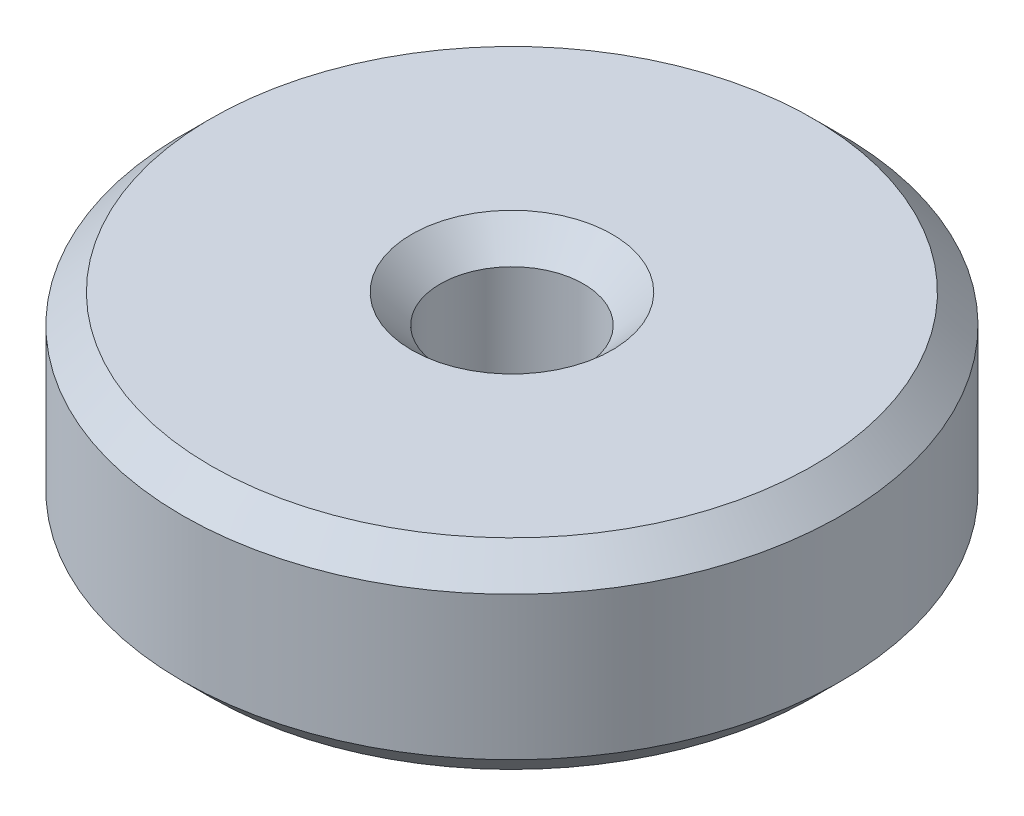
ISO-10303-21;
HEADER;
FILE_DESCRIPTION(('STEP AP214'),'2;1');
FILE_NAME('part.step','',(''),(''),'','','');
FILE_SCHEMA(('AUTOMOTIVE_DESIGN { 1 0 10303 214 1 1 1 1 }'));
ENDSEC;
DATA;
#1=APPLICATION_CONTEXT('core data for automotive mechanical design processes');
#2=APPLICATION_PROTOCOL_DEFINITION('international standard','automotive_design',2000,#1);
#3=PRODUCT_CONTEXT('',#1,'mechanical');
#4=PRODUCT('Part','Part','',(#3));
#5=PRODUCT_RELATED_PRODUCT_CATEGORY('part','',(#4));
#6=PRODUCT_DEFINITION_FORMATION('','',#4);
#7=PRODUCT_DEFINITION_CONTEXT('part definition',#1,'design');
#8=PRODUCT_DEFINITION('design','',#6,#7);
#9=PRODUCT_DEFINITION_SHAPE('','',#8);
#10=(LENGTH_UNIT() NAMED_UNIT(*) SI_UNIT(.MILLI.,.METRE.));
#11=(NAMED_UNIT(*) PLANE_ANGLE_UNIT() SI_UNIT($,.RADIAN.));
#12=(NAMED_UNIT(*) SI_UNIT($,.STERADIAN.) SOLID_ANGLE_UNIT());
#13=UNCERTAINTY_MEASURE_WITH_UNIT(LENGTH_MEASURE(1.E-05),#10,'distance_accuracy_value','');
#14=(GEOMETRIC_REPRESENTATION_CONTEXT(3) GLOBAL_UNCERTAINTY_ASSIGNED_CONTEXT((#13)) GLOBAL_UNIT_ASSIGNED_CONTEXT((#10,
#11,#12)) REPRESENTATION_CONTEXT('',''));
#15=CARTESIAN_POINT('',(0.,0.,0.));
#16=DIRECTION('',(0.,0.,1.));
#17=DIRECTION('',(1.,0.,0.));
#18=AXIS2_PLACEMENT_3D('',#15,#16,#17);
#19=CARTESIAN_POINT('',(0.,7.,0.));
#20=DIRECTION('',(0.,1.,0.));
#21=DIRECTION('',(0.,0.,1.));
#22=AXIS2_PLACEMENT_3D('',#19,#20,#21);
#23=PLANE('',#22);
#24=CARTESIAN_POINT('',(0.,7.,0.));
#25=DIRECTION('',(0.,1.,0.));
#26=DIRECTION('',(0.,0.,1.));
#27=AXIS2_PLACEMENT_3D('',#24,#25,#26);
#28=CIRCLE('',#27,3.5);
#29=CARTESIAN_POINT('',(0.,7.,3.5));
#30=VERTEX_POINT('',#29);
#31=EDGE_CURVE('E42',#30,#30,#28,.F.);
#32=ORIENTED_EDGE('',*,*,#31,.T.);
#33=EDGE_LOOP('',(#32));
#34=FACE_BOUND('',#33,.T.);
#35=CARTESIAN_POINT('',(0.,7.,0.));
#36=DIRECTION('',(0.,1.,0.));
#37=DIRECTION('',(0.,0.,1.));
#38=AXIS2_PLACEMENT_3D('',#35,#36,#37);
#39=CIRCLE('',#38,10.5);
#40=CARTESIAN_POINT('',(0.,7.,10.5));
#41=VERTEX_POINT('',#40);
#42=EDGE_CURVE('E46',#41,#41,#39,.T.);
#43=ORIENTED_EDGE('',*,*,#42,.T.);
#44=EDGE_LOOP('',(#43));
#45=FACE_BOUND('',#44,.T.);
#46=ADVANCED_FACE('F31',(#34,#45),#23,.T.);
#47=CARTESIAN_POINT('',(0.,0.,0.));
#48=DIRECTION('',(0.,1.,0.));
#49=DIRECTION('',(0.,0.,1.));
#50=AXIS2_PLACEMENT_3D('',#47,#48,#49);
#51=PLANE('',#50);
#52=CARTESIAN_POINT('',(0.,0.,0.));
#53=DIRECTION('',(0.,1.,0.));
#54=DIRECTION('',(0.,0.,1.));
#55=AXIS2_PLACEMENT_3D('',#52,#53,#54);
#56=CIRCLE('',#55,3.5);
#57=CARTESIAN_POINT('',(0.,0.,3.5));
#58=VERTEX_POINT('',#57);
#59=EDGE_CURVE('E57',#58,#58,#56,.T.);
#60=ORIENTED_EDGE('',*,*,#59,.T.);
#61=EDGE_LOOP('',(#60));
#62=FACE_BOUND('',#61,.T.);
#63=CARTESIAN_POINT('',(0.,0.,0.));
#64=DIRECTION('',(0.,1.,0.));
#65=DIRECTION('',(0.,0.,1.));
#66=AXIS2_PLACEMENT_3D('',#63,#64,#65);
#67=CIRCLE('',#66,10.5);
#68=CARTESIAN_POINT('',(0.,0.,10.5));
#69=VERTEX_POINT('',#68);
#70=EDGE_CURVE('E60',#69,#69,#67,.F.);
#71=ORIENTED_EDGE('',*,*,#70,.T.);
#72=EDGE_LOOP('',(#71));
#73=FACE_BOUND('',#72,.T.);
#74=ADVANCED_FACE('F64',(#62,#73),#51,.F.);
#75=CARTESIAN_POINT('',(0.,7.,0.));
#76=DIRECTION('',(0.,-1.,0.));
#77=DIRECTION('',(0.,0.,-1.));
#78=AXIS2_PLACEMENT_3D('',#75,#76,#77);
#79=CYLINDRICAL_SURFACE('',#78,11.5);
#80=CARTESIAN_POINT('',(0.,1.,0.));
#81=DIRECTION('',(0.,1.,0.));
#82=DIRECTION('',(0.,0.,1.));
#83=AXIS2_PLACEMENT_3D('',#80,#81,#82);
#84=CIRCLE('',#83,11.5);
#85=CARTESIAN_POINT('',(0.,1.,11.5));
#86=VERTEX_POINT('',#85);
#87=EDGE_CURVE('E10',#86,#86,#84,.T.);
#88=ORIENTED_EDGE('',*,*,#87,.T.);
#89=EDGE_LOOP('',(#88));
#90=FACE_BOUND('',#89,.T.);
#91=CARTESIAN_POINT('',(0.,6.00000000000001,0.));
#92=DIRECTION('',(0.,1.,0.));
#93=DIRECTION('',(0.,0.,1.));
#94=AXIS2_PLACEMENT_3D('',#91,#92,#93);
#95=CIRCLE('',#94,11.5);
#96=CARTESIAN_POINT('',(0.,6.00000000000001,11.5));
#97=VERTEX_POINT('',#96);
#98=EDGE_CURVE('E38',#97,#97,#95,.F.);
#99=ORIENTED_EDGE('',*,*,#98,.T.);
#100=EDGE_LOOP('',(#99));
#101=FACE_BOUND('',#100,.T.);
#102=ADVANCED_FACE('F84',(#90,#101),#79,.T.);
#103=CARTESIAN_POINT('',(0.,7.,0.));
#104=DIRECTION('',(0.,-1.,0.));
#105=DIRECTION('',(0.,0.,-1.));
#106=AXIS2_PLACEMENT_3D('',#103,#104,#105);
#107=CYLINDRICAL_SURFACE('',#106,2.5);
#108=CARTESIAN_POINT('',(0.,1.,0.));
#109=DIRECTION('',(0.,1.,0.));
#110=DIRECTION('',(0.,0.,1.));
#111=AXIS2_PLACEMENT_3D('',#108,#109,#110);
#112=CIRCLE('',#111,2.5);
#113=CARTESIAN_POINT('',(0.,1.,2.5));
#114=VERTEX_POINT('',#113);
#115=EDGE_CURVE('E51',#114,#114,#112,.F.);
#116=ORIENTED_EDGE('',*,*,#115,.T.);
#117=EDGE_LOOP('',(#116));
#118=FACE_BOUND('',#117,.T.);
#119=CARTESIAN_POINT('',(0.,6.,0.));
#120=DIRECTION('',(0.,1.,0.));
#121=DIRECTION('',(0.,0.,1.));
#122=AXIS2_PLACEMENT_3D('',#119,#120,#121);
#123=CIRCLE('',#122,2.5);
#124=CARTESIAN_POINT('',(0.,6.,2.5));
#125=VERTEX_POINT('',#124);
#126=EDGE_CURVE('E54',#125,#125,#123,.T.);
#127=ORIENTED_EDGE('',*,*,#126,.T.);
#128=EDGE_LOOP('',(#127));
#129=FACE_BOUND('',#128,.T.);
#130=ADVANCED_FACE('F89',(#118,#129),#107,.F.);
#131=CARTESIAN_POINT('',(0.,0.,0.));
#132=DIRECTION('',(0.,-1.,0.));
#133=DIRECTION('',(0.,0.,-1.));
#134=AXIS2_PLACEMENT_3D('',#131,#132,#133);
#135=CONICAL_SURFACE('',#134,3.5,0.785398163397447);
#136=ORIENTED_EDGE('',*,*,#115,.F.);
#137=EDGE_LOOP('',(#136));
#138=FACE_BOUND('',#137,.T.);
#139=ORIENTED_EDGE('',*,*,#59,.F.);
#140=EDGE_LOOP('',(#139));
#141=FACE_BOUND('',#140,.T.);
#142=ADVANCED_FACE('F75',(#138,#141),#135,.F.);
#143=CARTESIAN_POINT('',(0.,6.,0.));
#144=DIRECTION('',(0.,1.,0.));
#145=DIRECTION('',(0.,0.,1.));
#146=AXIS2_PLACEMENT_3D('',#143,#144,#145);
#147=CONICAL_SURFACE('',#146,2.5,0.785398163397449);
#148=ORIENTED_EDGE('',*,*,#31,.F.);
#149=EDGE_LOOP('',(#148));
#150=FACE_BOUND('',#149,.T.);
#151=ORIENTED_EDGE('',*,*,#126,.F.);
#152=EDGE_LOOP('',(#151));
#153=FACE_BOUND('',#152,.T.);
#154=ADVANCED_FACE('F69',(#150,#153),#147,.F.);
#155=CARTESIAN_POINT('',(0.,1.,0.));
#156=DIRECTION('',(0.,1.,0.));
#157=DIRECTION('',(0.,0.,1.));
#158=AXIS2_PLACEMENT_3D('',#155,#156,#157);
#159=CONICAL_SURFACE('',#158,11.5,0.785398163397451);
#160=ORIENTED_EDGE('',*,*,#70,.F.);
#161=EDGE_LOOP('',(#160));
#162=FACE_BOUND('',#161,.T.);
#163=ORIENTED_EDGE('',*,*,#87,.F.);
#164=EDGE_LOOP('',(#163));
#165=FACE_BOUND('',#164,.T.);
#166=ADVANCED_FACE('F66',(#162,#165),#159,.T.);
#167=CARTESIAN_POINT('',(0.,7.,0.));
#168=DIRECTION('',(0.,-1.,0.));
#169=DIRECTION('',(0.,0.,-1.));
#170=AXIS2_PLACEMENT_3D('',#167,#168,#169);
#171=CONICAL_SURFACE('',#170,10.5,0.78539816339745);
#172=ORIENTED_EDGE('',*,*,#98,.F.);
#173=EDGE_LOOP('',(#172));
#174=FACE_BOUND('',#173,.T.);
#175=ORIENTED_EDGE('',*,*,#42,.F.);
#176=EDGE_LOOP('',(#175));
#177=FACE_BOUND('',#176,.T.);
#178=ADVANCED_FACE('F33',(#174,#177),#171,.T.);
#179=CLOSED_SHELL('',(#46,#74,#102,#130,#142,#154,#166,#178));
#180=MANIFOLD_SOLID_BREP('B2',#179);
#181=ADVANCED_BREP_SHAPE_REPRESENTATION('',(#18,#180),#14);
#182=SHAPE_DEFINITION_REPRESENTATION(#9,#181);
ENDSEC;
END-ISO-10303-21;
